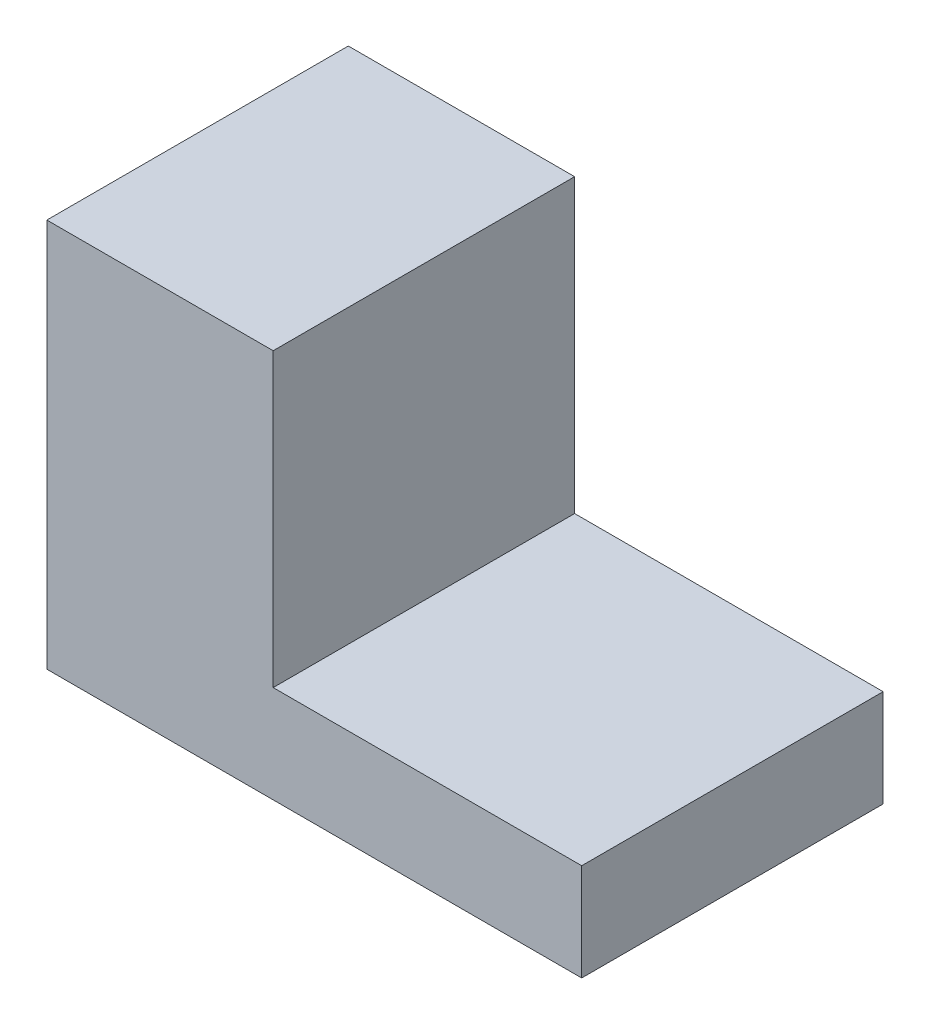
ISO-10303-21;
HEADER;
FILE_DESCRIPTION(('STEP AP214'),'2;1');
FILE_NAME('part.step','',(''),(''),'','','');
FILE_SCHEMA(('AUTOMOTIVE_DESIGN { 1 0 10303 214 1 1 1 1 }'));
ENDSEC;
DATA;
#1=APPLICATION_CONTEXT('core data for automotive mechanical design processes');
#2=APPLICATION_PROTOCOL_DEFINITION('international standard','automotive_design',2000,#1);
#3=PRODUCT_CONTEXT('',#1,'mechanical');
#4=PRODUCT('Part','Part','',(#3));
#5=PRODUCT_RELATED_PRODUCT_CATEGORY('part','',(#4));
#6=PRODUCT_DEFINITION_FORMATION('','',#4);
#7=PRODUCT_DEFINITION_CONTEXT('part definition',#1,'design');
#8=PRODUCT_DEFINITION('design','',#6,#7);
#9=PRODUCT_DEFINITION_SHAPE('','',#8);
#10=(LENGTH_UNIT() NAMED_UNIT(*) SI_UNIT(.MILLI.,.METRE.));
#11=(NAMED_UNIT(*) PLANE_ANGLE_UNIT() SI_UNIT($,.RADIAN.));
#12=(NAMED_UNIT(*) SI_UNIT($,.STERADIAN.) SOLID_ANGLE_UNIT());
#13=UNCERTAINTY_MEASURE_WITH_UNIT(LENGTH_MEASURE(1.E-05),#10,'distance_accuracy_value','');
#14=(GEOMETRIC_REPRESENTATION_CONTEXT(3) GLOBAL_UNCERTAINTY_ASSIGNED_CONTEXT((#13)) GLOBAL_UNIT_ASSIGNED_CONTEXT((#10,
#11,#12)) REPRESENTATION_CONTEXT('',''));
#15=CARTESIAN_POINT('',(0.,0.,0.));
#16=DIRECTION('',(0.,0.,1.));
#17=DIRECTION('',(1.,0.,0.));
#18=AXIS2_PLACEMENT_3D('',#15,#16,#17);
#19=CARTESIAN_POINT('',(0.,800.,-620.));
#20=DIRECTION('',(0.,0.,-1.));
#21=DIRECTION('',(-1.,0.,0.));
#22=AXIS2_PLACEMENT_3D('',#19,#20,#21);
#23=PLANE('',#22);
#24=DIRECTION('',(0.,1.,0.));
#25=VECTOR('',#24,1.);
#26=CARTESIAN_POINT('',(465.459723941256,200.,-620.));
#27=LINE('',#26,#25);
#28=CARTESIAN_POINT('',(465.459723941256,200.,-620.));
#29=VERTEX_POINT('',#28);
#30=CARTESIAN_POINT('',(465.459723941256,800.,-620.));
#31=VERTEX_POINT('',#30);
#32=EDGE_CURVE('E60',#29,#31,#27,.T.);
#33=ORIENTED_EDGE('',*,*,#32,.F.);
#34=DIRECTION('',(-1.,0.,0.));
#35=VECTOR('',#34,1.);
#36=CARTESIAN_POINT('',(1100.,200.,-620.));
#37=LINE('',#36,#35);
#38=CARTESIAN_POINT('',(1100.,200.,-620.));
#39=VERTEX_POINT('',#38);
#40=EDGE_CURVE('E156',#39,#29,#37,.T.);
#41=ORIENTED_EDGE('',*,*,#40,.F.);
#42=DIRECTION('',(0.,-1.,0.));
#43=VECTOR('',#42,1.);
#44=CARTESIAN_POINT('',(1100.,800.,-620.));
#45=LINE('',#44,#43);
#46=CARTESIAN_POINT('',(1100.,0.,-620.));
#47=VERTEX_POINT('',#46);
#48=EDGE_CURVE('E46',#39,#47,#45,.T.);
#49=ORIENTED_EDGE('',*,*,#48,.T.);
#50=DIRECTION('',(1.,0.,0.));
#51=VECTOR('',#50,1.);
#52=CARTESIAN_POINT('',(0.,0.,-620.));
#53=LINE('',#52,#51);
#54=CARTESIAN_POINT('',(0.,0.,-620.));
#55=VERTEX_POINT('',#54);
#56=EDGE_CURVE('E92',#55,#47,#53,.T.);
#57=ORIENTED_EDGE('',*,*,#56,.F.);
#58=DIRECTION('',(0.,-1.,0.));
#59=VECTOR('',#58,1.);
#60=CARTESIAN_POINT('',(0.,800.,-620.));
#61=LINE('',#60,#59);
#62=CARTESIAN_POINT('',(0.,800.,-620.));
#63=VERTEX_POINT('',#62);
#64=EDGE_CURVE('E11',#63,#55,#61,.T.);
#65=ORIENTED_EDGE('',*,*,#64,.F.);
#66=DIRECTION('',(1.,0.,0.));
#67=VECTOR('',#66,1.);
#68=CARTESIAN_POINT('',(0.,800.,-620.));
#69=LINE('',#68,#67);
#70=EDGE_CURVE('E107',#63,#31,#69,.T.);
#71=ORIENTED_EDGE('',*,*,#70,.T.);
#72=EDGE_LOOP('',(#33,#41,#49,#57,#65,#71));
#73=FACE_BOUND('',#72,.T.);
#74=ADVANCED_FACE('F43',(#73),#23,.T.);
#75=CARTESIAN_POINT('',(0.,800.,0.));
#76=DIRECTION('',(-1.,0.,0.));
#77=DIRECTION('',(0.,0.,1.));
#78=AXIS2_PLACEMENT_3D('',#75,#76,#77);
#79=PLANE('',#78);
#80=DIRECTION('',(0.,0.,-1.));
#81=VECTOR('',#80,1.);
#82=CARTESIAN_POINT('',(0.,0.,0.));
#83=LINE('',#82,#81);
#84=CARTESIAN_POINT('',(0.,0.,0.));
#85=VERTEX_POINT('',#84);
#86=EDGE_CURVE('E88',#85,#55,#83,.T.);
#87=ORIENTED_EDGE('',*,*,#86,.F.);
#88=DIRECTION('',(0.,-1.,0.));
#89=VECTOR('',#88,1.);
#90=CARTESIAN_POINT('',(0.,800.,0.));
#91=LINE('',#90,#89);
#92=CARTESIAN_POINT('',(0.,800.,0.));
#93=VERTEX_POINT('',#92);
#94=EDGE_CURVE('E52',#93,#85,#91,.T.);
#95=ORIENTED_EDGE('',*,*,#94,.F.);
#96=DIRECTION('',(0.,0.,-1.));
#97=VECTOR('',#96,1.);
#98=CARTESIAN_POINT('',(0.,800.,0.));
#99=LINE('',#98,#97);
#100=EDGE_CURVE('E90',#93,#63,#99,.T.);
#101=ORIENTED_EDGE('',*,*,#100,.T.);
#102=ORIENTED_EDGE('',*,*,#64,.T.);
#103=EDGE_LOOP('',(#87,#95,#101,#102));
#104=FACE_BOUND('',#103,.T.);
#105=ADVANCED_FACE('F86',(#104),#79,.T.);
#106=CARTESIAN_POINT('',(0.,800.,0.));
#107=DIRECTION('',(0.,0.,-1.));
#108=DIRECTION('',(-1.,0.,0.));
#109=AXIS2_PLACEMENT_3D('',#106,#107,#108);
#110=PLANE('',#109);
#111=DIRECTION('',(1.,0.,0.));
#112=VECTOR('',#111,1.);
#113=CARTESIAN_POINT('',(1100.,200.,0.));
#114=LINE('',#113,#112);
#115=CARTESIAN_POINT('',(465.459723941256,200.,0.));
#116=VERTEX_POINT('',#115);
#117=CARTESIAN_POINT('',(1100.,200.,0.));
#118=VERTEX_POINT('',#117);
#119=EDGE_CURVE('E146',#116,#118,#114,.T.);
#120=ORIENTED_EDGE('',*,*,#119,.F.);
#121=DIRECTION('',(0.,1.,0.));
#122=VECTOR('',#121,1.);
#123=CARTESIAN_POINT('',(465.459723941256,200.,0.));
#124=LINE('',#123,#122);
#125=CARTESIAN_POINT('',(465.459723941256,800.,0.));
#126=VERTEX_POINT('',#125);
#127=EDGE_CURVE('E100',#116,#126,#124,.T.);
#128=ORIENTED_EDGE('',*,*,#127,.T.);
#129=DIRECTION('',(1.,0.,0.));
#130=VECTOR('',#129,1.);
#131=CARTESIAN_POINT('',(0.,800.,0.));
#132=LINE('',#131,#130);
#133=EDGE_CURVE('E111',#93,#126,#132,.T.);
#134=ORIENTED_EDGE('',*,*,#133,.F.);
#135=ORIENTED_EDGE('',*,*,#94,.T.);
#136=DIRECTION('',(1.,0.,0.));
#137=VECTOR('',#136,1.);
#138=CARTESIAN_POINT('',(0.,0.,0.));
#139=LINE('',#138,#137);
#140=CARTESIAN_POINT('',(1100.,0.,0.));
#141=VERTEX_POINT('',#140);
#142=EDGE_CURVE('E105',#85,#141,#139,.T.);
#143=ORIENTED_EDGE('',*,*,#142,.T.);
#144=DIRECTION('',(0.,-1.,0.));
#145=VECTOR('',#144,1.);
#146=CARTESIAN_POINT('',(1100.,800.,0.));
#147=LINE('',#146,#145);
#148=EDGE_CURVE('E117',#118,#141,#147,.T.);
#149=ORIENTED_EDGE('',*,*,#148,.F.);
#150=EDGE_LOOP('',(#120,#128,#134,#135,#143,#149));
#151=FACE_BOUND('',#150,.T.);
#152=ADVANCED_FACE('F165',(#151),#110,.F.);
#153=CARTESIAN_POINT('',(1100.,800.,0.));
#154=DIRECTION('',(-1.,0.,0.));
#155=DIRECTION('',(0.,0.,1.));
#156=AXIS2_PLACEMENT_3D('',#153,#154,#155);
#157=PLANE('',#156);
#158=ORIENTED_EDGE('',*,*,#48,.F.);
#159=DIRECTION('',(0.,0.,-1.));
#160=VECTOR('',#159,1.);
#161=CARTESIAN_POINT('',(1100.,200.,-620.));
#162=LINE('',#161,#160);
#163=EDGE_CURVE('E132',#118,#39,#162,.T.);
#164=ORIENTED_EDGE('',*,*,#163,.F.);
#165=ORIENTED_EDGE('',*,*,#148,.T.);
#166=DIRECTION('',(0.,0.,-1.));
#167=VECTOR('',#166,1.);
#168=CARTESIAN_POINT('',(1100.,0.,0.));
#169=LINE('',#168,#167);
#170=EDGE_CURVE('E99',#141,#47,#169,.T.);
#171=ORIENTED_EDGE('',*,*,#170,.T.);
#172=EDGE_LOOP('',(#158,#164,#165,#171));
#173=FACE_BOUND('',#172,.T.);
#174=ADVANCED_FACE('F129',(#173),#157,.F.);
#175=CARTESIAN_POINT('',(0.,800.,0.));
#176=DIRECTION('',(0.,1.,0.));
#177=DIRECTION('',(0.,0.,1.));
#178=AXIS2_PLACEMENT_3D('',#175,#176,#177);
#179=PLANE('',#178);
#180=DIRECTION('',(0.,0.,1.));
#181=VECTOR('',#180,1.);
#182=CARTESIAN_POINT('',(465.459723941256,800.,-620.));
#183=LINE('',#182,#181);
#184=EDGE_CURVE('E160',#31,#126,#183,.T.);
#185=ORIENTED_EDGE('',*,*,#184,.F.);
#186=ORIENTED_EDGE('',*,*,#70,.F.);
#187=ORIENTED_EDGE('',*,*,#100,.F.);
#188=ORIENTED_EDGE('',*,*,#133,.T.);
#189=EDGE_LOOP('',(#185,#186,#187,#188));
#190=FACE_BOUND('',#189,.T.);
#191=ADVANCED_FACE('F167',(#190),#179,.T.);
#192=CARTESIAN_POINT('',(0.,0.,0.));
#193=DIRECTION('',(0.,1.,0.));
#194=DIRECTION('',(0.,0.,1.));
#195=AXIS2_PLACEMENT_3D('',#192,#193,#194);
#196=PLANE('',#195);
#197=ORIENTED_EDGE('',*,*,#56,.T.);
#198=ORIENTED_EDGE('',*,*,#170,.F.);
#199=ORIENTED_EDGE('',*,*,#142,.F.);
#200=ORIENTED_EDGE('',*,*,#86,.T.);
#201=EDGE_LOOP('',(#197,#198,#199,#200));
#202=FACE_BOUND('',#201,.T.);
#203=ADVANCED_FACE('F103',(#202),#196,.F.);
#204=CARTESIAN_POINT('',(465.459723941256,200.,-620.));
#205=DIRECTION('',(-1.,0.,0.));
#206=DIRECTION('',(0.,0.,1.));
#207=AXIS2_PLACEMENT_3D('',#204,#205,#206);
#208=PLANE('',#207);
#209=ORIENTED_EDGE('',*,*,#184,.T.);
#210=ORIENTED_EDGE('',*,*,#127,.F.);
#211=DIRECTION('',(0.,0.,1.));
#212=VECTOR('',#211,1.);
#213=CARTESIAN_POINT('',(465.459723941256,200.,-620.));
#214=LINE('',#213,#212);
#215=EDGE_CURVE('E148',#29,#116,#214,.T.);
#216=ORIENTED_EDGE('',*,*,#215,.F.);
#217=ORIENTED_EDGE('',*,*,#32,.T.);
#218=EDGE_LOOP('',(#209,#210,#216,#217));
#219=FACE_BOUND('',#218,.T.);
#220=ADVANCED_FACE('F171',(#219),#208,.F.);
#221=CARTESIAN_POINT('',(0.,200.,0.));
#222=DIRECTION('',(0.,-1.,0.));
#223=DIRECTION('',(0.,0.,-1.));
#224=AXIS2_PLACEMENT_3D('',#221,#222,#223);
#225=PLANE('',#224);
#226=ORIENTED_EDGE('',*,*,#163,.T.);
#227=ORIENTED_EDGE('',*,*,#40,.T.);
#228=ORIENTED_EDGE('',*,*,#215,.T.);
#229=ORIENTED_EDGE('',*,*,#119,.T.);
#230=EDGE_LOOP('',(#226,#227,#228,#229));
#231=FACE_BOUND('',#230,.T.);
#232=ADVANCED_FACE('F147',(#231),#225,.F.);
#233=CLOSED_SHELL('',(#74,#105,#152,#174,#191,#203,#220,#232));
#234=MANIFOLD_SOLID_BREP('B2',#233);
#235=ADVANCED_BREP_SHAPE_REPRESENTATION('',(#18,#234),#14);
#236=SHAPE_DEFINITION_REPRESENTATION(#9,#235);
ENDSEC;
END-ISO-10303-21;
